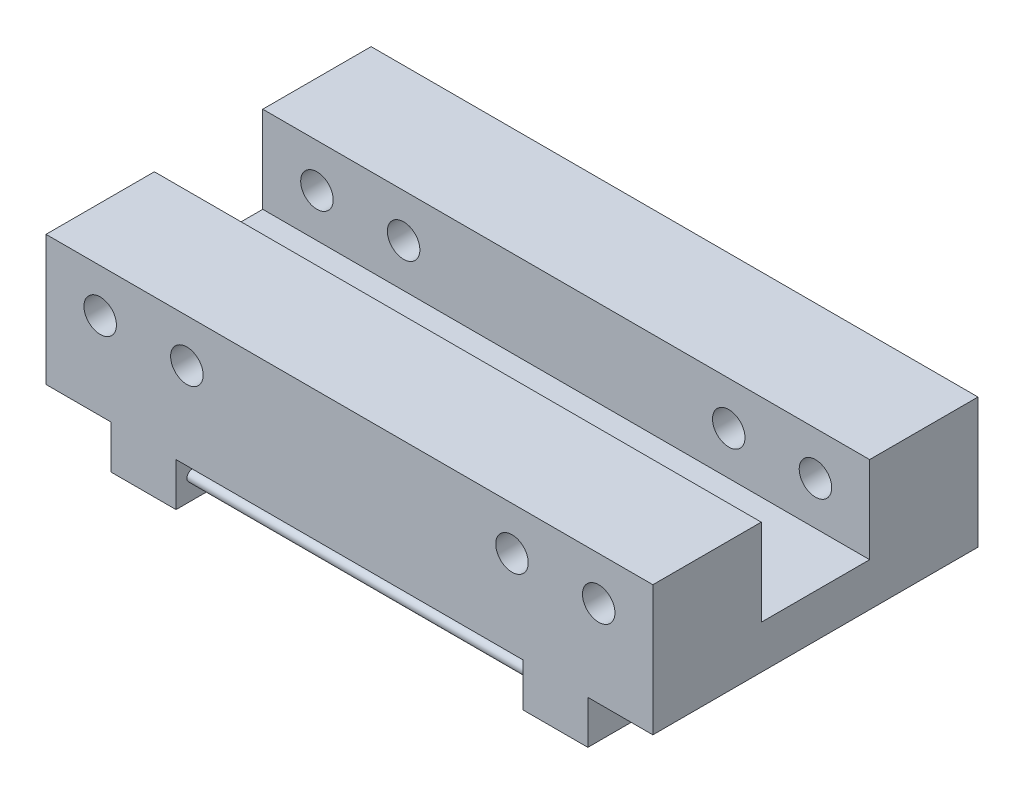
ISO-10303-21;
HEADER;
FILE_DESCRIPTION(('STEP AP214'),'2;1');
FILE_NAME('part.step','',(''),(''),'','','');
FILE_SCHEMA(('AUTOMOTIVE_DESIGN { 1 0 10303 214 1 1 1 1 }'));
ENDSEC;
DATA;
#1=APPLICATION_CONTEXT('core data for automotive mechanical design processes');
#2=APPLICATION_PROTOCOL_DEFINITION('international standard','automotive_design',2000,#1);
#3=PRODUCT_CONTEXT('',#1,'mechanical');
#4=PRODUCT('Part','Part','',(#3));
#5=PRODUCT_RELATED_PRODUCT_CATEGORY('part','',(#4));
#6=PRODUCT_DEFINITION_FORMATION('','',#4);
#7=PRODUCT_DEFINITION_CONTEXT('part definition',#1,'design');
#8=PRODUCT_DEFINITION('design','',#6,#7);
#9=PRODUCT_DEFINITION_SHAPE('','',#8);
#10=(LENGTH_UNIT() NAMED_UNIT(*) SI_UNIT(.MILLI.,.METRE.));
#11=(NAMED_UNIT(*) PLANE_ANGLE_UNIT() SI_UNIT($,.RADIAN.));
#12=(NAMED_UNIT(*) SI_UNIT($,.STERADIAN.) SOLID_ANGLE_UNIT());
#13=UNCERTAINTY_MEASURE_WITH_UNIT(LENGTH_MEASURE(1.E-05),#10,'distance_accuracy_value','');
#14=(GEOMETRIC_REPRESENTATION_CONTEXT(3) GLOBAL_UNCERTAINTY_ASSIGNED_CONTEXT((#13)) GLOBAL_UNIT_ASSIGNED_CONTEXT((#10,
#11,#12)) REPRESENTATION_CONTEXT('',''));
#15=CARTESIAN_POINT('',(0.,0.,0.));
#16=DIRECTION('',(0.,0.,1.));
#17=DIRECTION('',(1.,0.,0.));
#18=AXIS2_PLACEMENT_3D('',#15,#16,#17);
#19=CARTESIAN_POINT('',(0.,-20.,0.));
#20=DIRECTION('',(0.,1.,0.));
#21=DIRECTION('',(0.,0.,1.));
#22=AXIS2_PLACEMENT_3D('',#19,#20,#21);
#23=PLANE('',#22);
#24=DIRECTION('',(0.,0.,1.));
#25=VECTOR('',#24,1.);
#26=CARTESIAN_POINT('',(-30.0000000000001,-20.,-150.));
#27=LINE('',#26,#25);
#28=CARTESIAN_POINT('',(-30.0000000000001,-20.,-150.));
#29=VERTEX_POINT('',#28);
#30=CARTESIAN_POINT('',(-30.0000000000001,-20.,-120.));
#31=VERTEX_POINT('',#30);
#32=EDGE_CURVE('E300',#29,#31,#27,.T.);
#33=ORIENTED_EDGE('',*,*,#32,.F.);
#34=DIRECTION('',(-1.,0.,0.));
#35=VECTOR('',#34,1.);
#36=CARTESIAN_POINT('',(0.,-20.,-150.));
#37=LINE('',#36,#35);
#38=CARTESIAN_POINT('',(0.,-20.,-150.));
#39=VERTEX_POINT('',#38);
#40=EDGE_CURVE('E471',#39,#29,#37,.T.);
#41=ORIENTED_EDGE('',*,*,#40,.F.);
#42=DIRECTION('',(0.,0.,-1.));
#43=VECTOR('',#42,1.);
#44=CARTESIAN_POINT('',(0.,-20.,0.));
#45=LINE('',#44,#43);
#46=CARTESIAN_POINT('',(0.,-20.,0.));
#47=VERTEX_POINT('',#46);
#48=EDGE_CURVE('E465',#47,#39,#45,.T.);
#49=ORIENTED_EDGE('',*,*,#48,.F.);
#50=DIRECTION('',(1.,0.,0.));
#51=VECTOR('',#50,1.);
#52=CARTESIAN_POINT('',(0.,-20.,0.));
#53=LINE('',#52,#51);
#54=CARTESIAN_POINT('',(-30.,-20.,0.));
#55=VERTEX_POINT('',#54);
#56=EDGE_CURVE('E478',#55,#47,#53,.T.);
#57=ORIENTED_EDGE('',*,*,#56,.F.);
#58=DIRECTION('',(0.,0.,-1.));
#59=VECTOR('',#58,1.);
#60=CARTESIAN_POINT('',(-30.,-20.,0.));
#61=LINE('',#60,#59);
#62=CARTESIAN_POINT('',(-30.,-20.,-30.));
#63=VERTEX_POINT('',#62);
#64=EDGE_CURVE('E340',#55,#63,#61,.T.);
#65=ORIENTED_EDGE('',*,*,#64,.T.);
#66=DIRECTION('',(-1.,0.,0.));
#67=VECTOR('',#66,1.);
#68=CARTESIAN_POINT('',(-30.,-20.,-30.));
#69=LINE('',#68,#67);
#70=CARTESIAN_POINT('',(-60.,-20.,-30.));
#71=VERTEX_POINT('',#70);
#72=EDGE_CURVE('E346',#63,#71,#69,.T.);
#73=ORIENTED_EDGE('',*,*,#72,.T.);
#74=DIRECTION('',(0.,0.,1.));
#75=VECTOR('',#74,1.);
#76=CARTESIAN_POINT('',(-60.,-20.,0.));
#77=LINE('',#76,#75);
#78=CARTESIAN_POINT('',(-60.,-20.,0.));
#79=VERTEX_POINT('',#78);
#80=EDGE_CURVE('E362',#71,#79,#77,.T.);
#81=ORIENTED_EDGE('',*,*,#80,.T.);
#82=CARTESIAN_POINT('',(-220.,-20.,0.));
#83=VERTEX_POINT('',#82);
#84=EDGE_CURVE('E483',#83,#79,#53,.T.);
#85=ORIENTED_EDGE('',*,*,#84,.F.);
#86=DIRECTION('',(0.,0.,1.));
#87=VECTOR('',#86,1.);
#88=CARTESIAN_POINT('',(-220.,-20.,0.));
#89=LINE('',#88,#87);
#90=CARTESIAN_POINT('',(-220.,-20.,-30.));
#91=VERTEX_POINT('',#90);
#92=EDGE_CURVE('E429',#91,#83,#89,.T.);
#93=ORIENTED_EDGE('',*,*,#92,.F.);
#94=DIRECTION('',(1.,0.,0.));
#95=VECTOR('',#94,1.);
#96=CARTESIAN_POINT('',(-250.,-20.,-30.));
#97=LINE('',#96,#95);
#98=CARTESIAN_POINT('',(-250.,-20.,-30.));
#99=VERTEX_POINT('',#98);
#100=EDGE_CURVE('E442',#99,#91,#97,.T.);
#101=ORIENTED_EDGE('',*,*,#100,.F.);
#102=DIRECTION('',(0.,0.,-1.));
#103=VECTOR('',#102,1.);
#104=CARTESIAN_POINT('',(-250.,-20.,0.));
#105=LINE('',#104,#103);
#106=CARTESIAN_POINT('',(-250.,-20.,0.));
#107=VERTEX_POINT('',#106);
#108=EDGE_CURVE('E423',#107,#99,#105,.T.);
#109=ORIENTED_EDGE('',*,*,#108,.F.);
#110=CARTESIAN_POINT('',(-280.,-20.,0.));
#111=VERTEX_POINT('',#110);
#112=EDGE_CURVE('E479',#111,#107,#53,.T.);
#113=ORIENTED_EDGE('',*,*,#112,.F.);
#114=DIRECTION('',(0.,0.,1.));
#115=VECTOR('',#114,1.);
#116=CARTESIAN_POINT('',(-280.,-20.,0.));
#117=LINE('',#116,#115);
#118=CARTESIAN_POINT('',(-280.,-20.,-150.));
#119=VERTEX_POINT('',#118);
#120=EDGE_CURVE('E222',#119,#111,#117,.T.);
#121=ORIENTED_EDGE('',*,*,#120,.F.);
#122=CARTESIAN_POINT('',(-250.,-20.,-150.));
#123=VERTEX_POINT('',#122);
#124=EDGE_CURVE('E469',#123,#119,#37,.T.);
#125=ORIENTED_EDGE('',*,*,#124,.F.);
#126=DIRECTION('',(0.,0.,1.));
#127=VECTOR('',#126,1.);
#128=CARTESIAN_POINT('',(-250.,-20.,-150.));
#129=LINE('',#128,#127);
#130=CARTESIAN_POINT('',(-250.,-20.,-120.));
#131=VERTEX_POINT('',#130);
#132=EDGE_CURVE('E381',#123,#131,#129,.T.);
#133=ORIENTED_EDGE('',*,*,#132,.T.);
#134=DIRECTION('',(1.,0.,0.));
#135=VECTOR('',#134,1.);
#136=CARTESIAN_POINT('',(-250.,-20.,-120.));
#137=LINE('',#136,#135);
#138=CARTESIAN_POINT('',(-220.,-20.,-120.));
#139=VERTEX_POINT('',#138);
#140=EDGE_CURVE('E387',#131,#139,#137,.T.);
#141=ORIENTED_EDGE('',*,*,#140,.T.);
#142=DIRECTION('',(0.,0.,-1.));
#143=VECTOR('',#142,1.);
#144=CARTESIAN_POINT('',(-220.,-20.,-150.));
#145=LINE('',#144,#143);
#146=CARTESIAN_POINT('',(-220.,-20.,-150.));
#147=VERTEX_POINT('',#146);
#148=EDGE_CURVE('E403',#139,#147,#145,.T.);
#149=ORIENTED_EDGE('',*,*,#148,.T.);
#150=CARTESIAN_POINT('',(-60.0000000000001,-20.,-150.));
#151=VERTEX_POINT('',#150);
#152=EDGE_CURVE('E475',#151,#147,#37,.T.);
#153=ORIENTED_EDGE('',*,*,#152,.F.);
#154=DIRECTION('',(0.,0.,-1.));
#155=VECTOR('',#154,1.);
#156=CARTESIAN_POINT('',(-60.0000000000001,-20.,-150.));
#157=LINE('',#156,#155);
#158=CARTESIAN_POINT('',(-60.0000000000001,-20.,-120.));
#159=VERTEX_POINT('',#158);
#160=EDGE_CURVE('E309',#159,#151,#157,.T.);
#161=ORIENTED_EDGE('',*,*,#160,.F.);
#162=DIRECTION('',(-1.,0.,0.));
#163=VECTOR('',#162,1.);
#164=CARTESIAN_POINT('',(-30.0000000000001,-20.,-120.));
#165=LINE('',#164,#163);
#166=EDGE_CURVE('E322',#31,#159,#165,.T.);
#167=ORIENTED_EDGE('',*,*,#166,.F.);
#168=EDGE_LOOP('',(#33,#41,#49,#57,#65,#73,#81,#85,#93,#101,#109,#113,#121,#125,#133,#141,#149,
#153,#161,#167));
#169=FACE_BOUND('',#168,.T.);
#170=ADVANCED_FACE('F51',(#169),#23,.F.);
#171=CARTESIAN_POINT('',(0.,-20.,0.));
#172=DIRECTION('',(1.,0.,0.));
#173=DIRECTION('',(0.,0.,-1.));
#174=AXIS2_PLACEMENT_3D('',#171,#172,#173);
#175=PLANE('',#174);
#176=DIRECTION('',(0.,0.,-1.));
#177=VECTOR('',#176,1.);
#178=CARTESIAN_POINT('',(0.,0.,0.));
#179=LINE('',#178,#177);
#180=CARTESIAN_POINT('',(0.,0.,-50.));
#181=VERTEX_POINT('',#180);
#182=CARTESIAN_POINT('',(0.,0.,-99.9999999999999));
#183=VERTEX_POINT('',#182);
#184=EDGE_CURVE('E464',#181,#183,#179,.T.);
#185=ORIENTED_EDGE('',*,*,#184,.F.);
#186=DIRECTION('',(0.,-1.,0.));
#187=VECTOR('',#186,1.);
#188=CARTESIAN_POINT('',(0.,40.,-50.0000000000001));
#189=LINE('',#188,#187);
#190=CARTESIAN_POINT('',(0.,40.,-50.0000000000001));
#191=VERTEX_POINT('',#190);
#192=EDGE_CURVE('E258',#191,#181,#189,.T.);
#193=ORIENTED_EDGE('',*,*,#192,.F.);
#194=DIRECTION('',(0.,0.,1.));
#195=VECTOR('',#194,1.);
#196=CARTESIAN_POINT('',(0.,40.,0.));
#197=LINE('',#196,#195);
#198=CARTESIAN_POINT('',(0.,40.,0.));
#199=VERTEX_POINT('',#198);
#200=EDGE_CURVE('E244',#191,#199,#197,.T.);
#201=ORIENTED_EDGE('',*,*,#200,.T.);
#202=DIRECTION('',(0.,1.,0.));
#203=VECTOR('',#202,1.);
#204=CARTESIAN_POINT('',(0.,-20.,0.));
#205=LINE('',#204,#203);
#206=EDGE_CURVE('E228',#47,#199,#205,.T.);
#207=ORIENTED_EDGE('',*,*,#206,.F.);
#208=ORIENTED_EDGE('',*,*,#48,.T.);
#209=DIRECTION('',(0.,1.,0.));
#210=VECTOR('',#209,1.);
#211=CARTESIAN_POINT('',(0.,-20.,-150.));
#212=LINE('',#211,#210);
#213=CARTESIAN_POINT('',(0.,40.,-150.));
#214=VERTEX_POINT('',#213);
#215=EDGE_CURVE('E482',#39,#214,#212,.T.);
#216=ORIENTED_EDGE('',*,*,#215,.T.);
#217=DIRECTION('',(0.,0.,-1.));
#218=VECTOR('',#217,1.);
#219=CARTESIAN_POINT('',(0.,40.,-150.));
#220=LINE('',#219,#218);
#221=CARTESIAN_POINT('',(0.,40.,-99.9999999999999));
#222=VERTEX_POINT('',#221);
#223=EDGE_CURVE('E269',#222,#214,#220,.T.);
#224=ORIENTED_EDGE('',*,*,#223,.F.);
#225=DIRECTION('',(0.,-1.,0.));
#226=VECTOR('',#225,1.);
#227=CARTESIAN_POINT('',(0.,40.,-99.9999999999999));
#228=LINE('',#227,#226);
#229=EDGE_CURVE('E277',#222,#183,#228,.T.);
#230=ORIENTED_EDGE('',*,*,#229,.T.);
#231=EDGE_LOOP('',(#185,#193,#201,#207,#208,#216,#224,#230));
#232=FACE_BOUND('',#231,.T.);
#233=ADVANCED_FACE('F53',(#232),#175,.T.);
#234=CARTESIAN_POINT('',(0.,-20.,0.));
#235=DIRECTION('',(0.,0.,1.));
#236=DIRECTION('',(1.,0.,0.));
#237=AXIS2_PLACEMENT_3D('',#234,#235,#236);
#238=PLANE('',#237);
#239=CARTESIAN_POINT('',(-25.,20.,0.));
#240=DIRECTION('',(0.,0.,-1.));
#241=DIRECTION('',(-1.,0.,0.));
#242=AXIS2_PLACEMENT_3D('',#239,#240,#241);
#243=CIRCLE('',#242,7.5);
#244=CARTESIAN_POINT('',(-32.5,20.,0.));
#245=VERTEX_POINT('',#244);
#246=EDGE_CURVE('E510',#245,#245,#243,.T.);
#247=ORIENTED_EDGE('',*,*,#246,.T.);
#248=EDGE_LOOP('',(#247));
#249=FACE_BOUND('',#248,.T.);
#250=CARTESIAN_POINT('',(-65.,20.,0.));
#251=DIRECTION('',(0.,0.,-1.));
#252=DIRECTION('',(-1.,0.,0.));
#253=AXIS2_PLACEMENT_3D('',#250,#251,#252);
#254=CIRCLE('',#253,7.50000000000001);
#255=CARTESIAN_POINT('',(-72.5,20.,0.));
#256=VERTEX_POINT('',#255);
#257=EDGE_CURVE('E649',#256,#256,#254,.T.);
#258=ORIENTED_EDGE('',*,*,#257,.T.);
#259=EDGE_LOOP('',(#258));
#260=FACE_BOUND('',#259,.T.);
#261=CARTESIAN_POINT('',(-215.,20.,1.11022302462516E-13));
#262=DIRECTION('',(0.,0.,-1.));
#263=DIRECTION('',(-1.,0.,0.));
#264=AXIS2_PLACEMENT_3D('',#261,#262,#263);
#265=CIRCLE('',#264,7.50000000000001);
#266=CARTESIAN_POINT('',(-222.5,20.,1.12509208299067E-13));
#267=VERTEX_POINT('',#266);
#268=EDGE_CURVE('E638',#267,#267,#265,.T.);
#269=ORIENTED_EDGE('',*,*,#268,.T.);
#270=EDGE_LOOP('',(#269));
#271=FACE_BOUND('',#270,.T.);
#272=CARTESIAN_POINT('',(-255.,20.,1.11022302462516E-13));
#273=DIRECTION('',(0.,0.,-1.));
#274=DIRECTION('',(-1.,0.,0.));
#275=AXIS2_PLACEMENT_3D('',#272,#273,#274);
#276=CIRCLE('',#275,7.50000000000001);
#277=CARTESIAN_POINT('',(-262.5,20.,1.12509208299067E-13));
#278=VERTEX_POINT('',#277);
#279=EDGE_CURVE('E639',#278,#278,#276,.T.);
#280=ORIENTED_EDGE('',*,*,#279,.T.);
#281=EDGE_LOOP('',(#280));
#282=FACE_BOUND('',#281,.T.);
#283=ORIENTED_EDGE('',*,*,#206,.T.);
#284=DIRECTION('',(-1.,0.,0.));
#285=VECTOR('',#284,1.);
#286=CARTESIAN_POINT('',(-280.,40.,0.));
#287=LINE('',#286,#285);
#288=CARTESIAN_POINT('',(-280.,40.,0.));
#289=VERTEX_POINT('',#288);
#290=EDGE_CURVE('E235',#199,#289,#287,.T.);
#291=ORIENTED_EDGE('',*,*,#290,.T.);
#292=DIRECTION('',(0.,1.,0.));
#293=VECTOR('',#292,1.);
#294=CARTESIAN_POINT('',(-280.,-20.,0.));
#295=LINE('',#294,#293);
#296=EDGE_CURVE('E214',#111,#289,#295,.T.);
#297=ORIENTED_EDGE('',*,*,#296,.F.);
#298=ORIENTED_EDGE('',*,*,#112,.T.);
#299=DIRECTION('',(0.,1.,0.));
#300=VECTOR('',#299,1.);
#301=CARTESIAN_POINT('',(-250.,-40.,0.));
#302=LINE('',#301,#300);
#303=CARTESIAN_POINT('',(-250.,-40.,0.));
#304=VERTEX_POINT('',#303);
#305=EDGE_CURVE('E438',#304,#107,#302,.T.);
#306=ORIENTED_EDGE('',*,*,#305,.F.);
#307=DIRECTION('',(-1.,0.,0.));
#308=VECTOR('',#307,1.);
#309=CARTESIAN_POINT('',(-250.,-40.,0.));
#310=LINE('',#309,#308);
#311=CARTESIAN_POINT('',(-220.,-40.,0.));
#312=VERTEX_POINT('',#311);
#313=EDGE_CURVE('E435',#312,#304,#310,.T.);
#314=ORIENTED_EDGE('',*,*,#313,.F.);
#315=DIRECTION('',(0.,1.,0.));
#316=VECTOR('',#315,1.);
#317=CARTESIAN_POINT('',(-220.,-40.,0.));
#318=LINE('',#317,#316);
#319=EDGE_CURVE('E452',#312,#83,#318,.T.);
#320=ORIENTED_EDGE('',*,*,#319,.T.);
#321=ORIENTED_EDGE('',*,*,#84,.T.);
#322=DIRECTION('',(0.,1.,0.));
#323=VECTOR('',#322,1.);
#324=CARTESIAN_POINT('',(-60.,-40.,0.));
#325=LINE('',#324,#323);
#326=CARTESIAN_POINT('',(-60.,-40.,0.));
#327=VERTEX_POINT('',#326);
#328=EDGE_CURVE('E374',#327,#79,#325,.T.);
#329=ORIENTED_EDGE('',*,*,#328,.F.);
#330=DIRECTION('',(1.,0.,0.));
#331=VECTOR('',#330,1.);
#332=CARTESIAN_POINT('',(-30.,-40.,0.));
#333=LINE('',#332,#331);
#334=CARTESIAN_POINT('',(-30.,-40.,0.));
#335=VERTEX_POINT('',#334);
#336=EDGE_CURVE('E345',#327,#335,#333,.T.);
#337=ORIENTED_EDGE('',*,*,#336,.T.);
#338=DIRECTION('',(0.,1.,0.));
#339=VECTOR('',#338,1.);
#340=CARTESIAN_POINT('',(-30.,-40.,0.));
#341=LINE('',#340,#339);
#342=EDGE_CURVE('E377',#335,#55,#341,.T.);
#343=ORIENTED_EDGE('',*,*,#342,.T.);
#344=ORIENTED_EDGE('',*,*,#56,.T.);
#345=EDGE_LOOP('',(#283,#291,#297,#298,#306,#314,#320,#321,#329,#337,#343,#344));
#346=FACE_BOUND('',#345,.T.);
#347=ADVANCED_FACE('F241',(#249,#260,#271,#282,#346),#238,.T.);
#348=CARTESIAN_POINT('',(-280.,-20.,0.));
#349=DIRECTION('',(-1.,0.,0.));
#350=DIRECTION('',(0.,0.,1.));
#351=AXIS2_PLACEMENT_3D('',#348,#349,#350);
#352=PLANE('',#351);
#353=DIRECTION('',(0.,0.,1.));
#354=VECTOR('',#353,1.);
#355=CARTESIAN_POINT('',(-280.,0.,0.));
#356=LINE('',#355,#354);
#357=CARTESIAN_POINT('',(-280.,0.,-99.9999999999999));
#358=VERTEX_POINT('',#357);
#359=CARTESIAN_POINT('',(-280.,0.,-50.));
#360=VERTEX_POINT('',#359);
#361=EDGE_CURVE('E470',#358,#360,#356,.T.);
#362=ORIENTED_EDGE('',*,*,#361,.F.);
#363=DIRECTION('',(0.,-1.,0.));
#364=VECTOR('',#363,1.);
#365=CARTESIAN_POINT('',(-280.,40.,-99.9999999999999));
#366=LINE('',#365,#364);
#367=CARTESIAN_POINT('',(-280.,40.,-99.9999999999999));
#368=VERTEX_POINT('',#367);
#369=EDGE_CURVE('E283',#368,#358,#366,.T.);
#370=ORIENTED_EDGE('',*,*,#369,.F.);
#371=DIRECTION('',(0.,0.,1.));
#372=VECTOR('',#371,1.);
#373=CARTESIAN_POINT('',(-280.,40.,-150.));
#374=LINE('',#373,#372);
#375=CARTESIAN_POINT('',(-280.,40.,-150.));
#376=VERTEX_POINT('',#375);
#377=EDGE_CURVE('E262',#376,#368,#374,.T.);
#378=ORIENTED_EDGE('',*,*,#377,.F.);
#379=DIRECTION('',(0.,1.,0.));
#380=VECTOR('',#379,1.);
#381=CARTESIAN_POINT('',(-280.,-20.,-150.));
#382=LINE('',#381,#380);
#383=EDGE_CURVE('E229',#119,#376,#382,.T.);
#384=ORIENTED_EDGE('',*,*,#383,.F.);
#385=ORIENTED_EDGE('',*,*,#120,.T.);
#386=ORIENTED_EDGE('',*,*,#296,.T.);
#387=DIRECTION('',(0.,0.,-1.));
#388=VECTOR('',#387,1.);
#389=CARTESIAN_POINT('',(-280.,40.,0.));
#390=LINE('',#389,#388);
#391=CARTESIAN_POINT('',(-280.,40.,-50.));
#392=VERTEX_POINT('',#391);
#393=EDGE_CURVE('E218',#289,#392,#390,.T.);
#394=ORIENTED_EDGE('',*,*,#393,.T.);
#395=DIRECTION('',(0.,-1.,0.));
#396=VECTOR('',#395,1.);
#397=CARTESIAN_POINT('',(-280.,40.,-50.));
#398=LINE('',#397,#396);
#399=EDGE_CURVE('E252',#392,#360,#398,.T.);
#400=ORIENTED_EDGE('',*,*,#399,.T.);
#401=EDGE_LOOP('',(#362,#370,#378,#384,#385,#386,#394,#400));
#402=FACE_BOUND('',#401,.T.);
#403=ADVANCED_FACE('F216',(#402),#352,.T.);
#404=CARTESIAN_POINT('',(0.,-20.,-150.));
#405=DIRECTION('',(0.,0.,-1.));
#406=DIRECTION('',(-1.,0.,0.));
#407=AXIS2_PLACEMENT_3D('',#404,#405,#406);
#408=PLANE('',#407);
#409=CARTESIAN_POINT('',(-25.,20.,-150.));
#410=DIRECTION('',(0.,0.,-1.));
#411=DIRECTION('',(-1.,0.,0.));
#412=AXIS2_PLACEMENT_3D('',#409,#410,#411);
#413=CIRCLE('',#412,7.5);
#414=CARTESIAN_POINT('',(-32.5,20.,-150.));
#415=VERTEX_POINT('',#414);
#416=EDGE_CURVE('E624',#415,#415,#413,.T.);
#417=ORIENTED_EDGE('',*,*,#416,.F.);
#418=EDGE_LOOP('',(#417));
#419=FACE_BOUND('',#418,.T.);
#420=CARTESIAN_POINT('',(-65.,20.,-150.));
#421=DIRECTION('',(0.,0.,-1.));
#422=DIRECTION('',(-1.,0.,0.));
#423=AXIS2_PLACEMENT_3D('',#420,#421,#422);
#424=CIRCLE('',#423,7.50000000000001);
#425=CARTESIAN_POINT('',(-72.5,20.,-150.));
#426=VERTEX_POINT('',#425);
#427=EDGE_CURVE('E628',#426,#426,#424,.T.);
#428=ORIENTED_EDGE('',*,*,#427,.F.);
#429=EDGE_LOOP('',(#428));
#430=FACE_BOUND('',#429,.T.);
#431=CARTESIAN_POINT('',(-215.,20.,-150.));
#432=DIRECTION('',(0.,0.,-1.));
#433=DIRECTION('',(-1.,0.,0.));
#434=AXIS2_PLACEMENT_3D('',#431,#432,#433);
#435=CIRCLE('',#434,7.50000000000001);
#436=CARTESIAN_POINT('',(-222.5,20.,-150.));
#437=VERTEX_POINT('',#436);
#438=EDGE_CURVE('E632',#437,#437,#435,.T.);
#439=ORIENTED_EDGE('',*,*,#438,.F.);
#440=EDGE_LOOP('',(#439));
#441=FACE_BOUND('',#440,.T.);
#442=CARTESIAN_POINT('',(-255.,20.,-150.));
#443=DIRECTION('',(0.,0.,-1.));
#444=DIRECTION('',(-1.,0.,0.));
#445=AXIS2_PLACEMENT_3D('',#442,#443,#444);
#446=CIRCLE('',#445,7.50000000000001);
#447=CARTESIAN_POINT('',(-262.5,20.,-150.));
#448=VERTEX_POINT('',#447);
#449=EDGE_CURVE('E635',#448,#448,#446,.T.);
#450=ORIENTED_EDGE('',*,*,#449,.F.);
#451=EDGE_LOOP('',(#450));
#452=FACE_BOUND('',#451,.T.);
#453=ORIENTED_EDGE('',*,*,#383,.T.);
#454=DIRECTION('',(-1.,0.,0.));
#455=VECTOR('',#454,1.);
#456=CARTESIAN_POINT('',(-280.,40.,-150.));
#457=LINE('',#456,#455);
#458=EDGE_CURVE('E273',#214,#376,#457,.T.);
#459=ORIENTED_EDGE('',*,*,#458,.F.);
#460=ORIENTED_EDGE('',*,*,#215,.F.);
#461=ORIENTED_EDGE('',*,*,#40,.T.);
#462=DIRECTION('',(0.,1.,0.));
#463=VECTOR('',#462,1.);
#464=CARTESIAN_POINT('',(-30.0000000000001,-40.,-150.));
#465=LINE('',#464,#463);
#466=CARTESIAN_POINT('',(-30.0000000000001,-40.,-150.));
#467=VERTEX_POINT('',#466);
#468=EDGE_CURVE('E318',#467,#29,#465,.T.);
#469=ORIENTED_EDGE('',*,*,#468,.F.);
#470=DIRECTION('',(1.,0.,0.));
#471=VECTOR('',#470,1.);
#472=CARTESIAN_POINT('',(-30.0000000000001,-40.,-150.));
#473=LINE('',#472,#471);
#474=CARTESIAN_POINT('',(-60.0000000000001,-40.,-150.));
#475=VERTEX_POINT('',#474);
#476=EDGE_CURVE('E315',#475,#467,#473,.T.);
#477=ORIENTED_EDGE('',*,*,#476,.F.);
#478=DIRECTION('',(0.,1.,0.));
#479=VECTOR('',#478,1.);
#480=CARTESIAN_POINT('',(-60.0000000000001,-40.,-150.));
#481=LINE('',#480,#479);
#482=EDGE_CURVE('E330',#475,#151,#481,.T.);
#483=ORIENTED_EDGE('',*,*,#482,.T.);
#484=ORIENTED_EDGE('',*,*,#152,.T.);
#485=DIRECTION('',(0.,1.,0.));
#486=VECTOR('',#485,1.);
#487=CARTESIAN_POINT('',(-220.,-40.,-150.));
#488=LINE('',#487,#486);
#489=CARTESIAN_POINT('',(-220.,-40.,-150.));
#490=VERTEX_POINT('',#489);
#491=EDGE_CURVE('E415',#490,#147,#488,.T.);
#492=ORIENTED_EDGE('',*,*,#491,.F.);
#493=DIRECTION('',(-1.,0.,0.));
#494=VECTOR('',#493,1.);
#495=CARTESIAN_POINT('',(-250.,-40.,-150.));
#496=LINE('',#495,#494);
#497=CARTESIAN_POINT('',(-250.,-40.,-150.));
#498=VERTEX_POINT('',#497);
#499=EDGE_CURVE('E386',#490,#498,#496,.T.);
#500=ORIENTED_EDGE('',*,*,#499,.T.);
#501=DIRECTION('',(0.,1.,0.));
#502=VECTOR('',#501,1.);
#503=CARTESIAN_POINT('',(-250.,-40.,-150.));
#504=LINE('',#503,#502);
#505=EDGE_CURVE('E419',#498,#123,#504,.T.);
#506=ORIENTED_EDGE('',*,*,#505,.T.);
#507=ORIENTED_EDGE('',*,*,#124,.T.);
#508=EDGE_LOOP('',(#453,#459,#460,#461,#469,#477,#483,#484,#492,#500,#506,#507));
#509=FACE_BOUND('',#508,.T.);
#510=ADVANCED_FACE('F563',(#419,#430,#441,#452,#509),#408,.T.);
#511=CARTESIAN_POINT('',(0.,0.,0.));
#512=DIRECTION('',(0.,1.,0.));
#513=DIRECTION('',(0.,0.,1.));
#514=AXIS2_PLACEMENT_3D('',#511,#512,#513);
#515=PLANE('',#514);
#516=DIRECTION('',(1.,0.,0.));
#517=VECTOR('',#516,1.);
#518=CARTESIAN_POINT('',(-280.,0.,-50.));
#519=LINE('',#518,#517);
#520=EDGE_CURVE('E69',#360,#181,#519,.T.);
#521=ORIENTED_EDGE('',*,*,#520,.T.);
#522=ORIENTED_EDGE('',*,*,#184,.T.);
#523=DIRECTION('',(1.,0.,0.));
#524=VECTOR('',#523,1.);
#525=CARTESIAN_POINT('',(-280.,0.,-99.9999999999999));
#526=LINE('',#525,#524);
#527=EDGE_CURVE('E74',#358,#183,#526,.T.);
#528=ORIENTED_EDGE('',*,*,#527,.F.);
#529=ORIENTED_EDGE('',*,*,#361,.T.);
#530=EDGE_LOOP('',(#521,#522,#528,#529));
#531=FACE_BOUND('',#530,.T.);
#532=ADVANCED_FACE('F555',(#531),#515,.T.);
#533=CARTESIAN_POINT('',(-250.,-40.,0.));
#534=DIRECTION('',(1.,0.,0.));
#535=DIRECTION('',(0.,0.,-1.));
#536=AXIS2_PLACEMENT_3D('',#533,#534,#535);
#537=PLANE('',#536);
#538=ORIENTED_EDGE('',*,*,#108,.T.);
#539=DIRECTION('',(0.,1.,0.));
#540=VECTOR('',#539,1.);
#541=CARTESIAN_POINT('',(-250.,-40.,-30.));
#542=LINE('',#541,#540);
#543=CARTESIAN_POINT('',(-250.,-40.,-30.));
#544=VERTEX_POINT('',#543);
#545=EDGE_CURVE('E460',#544,#99,#542,.T.);
#546=ORIENTED_EDGE('',*,*,#545,.F.);
#547=DIRECTION('',(0.,0.,-1.));
#548=VECTOR('',#547,1.);
#549=CARTESIAN_POINT('',(-250.,-40.,0.));
#550=LINE('',#549,#548);
#551=EDGE_CURVE('E424',#304,#544,#550,.T.);
#552=ORIENTED_EDGE('',*,*,#551,.F.);
#553=ORIENTED_EDGE('',*,*,#305,.T.);
#554=EDGE_LOOP('',(#538,#546,#552,#553));
#555=FACE_BOUND('',#554,.T.);
#556=ADVANCED_FACE('F608',(#555),#537,.F.);
#557=CARTESIAN_POINT('',(-250.,-40.,-30.));
#558=DIRECTION('',(0.,0.,1.));
#559=DIRECTION('',(1.,0.,0.));
#560=AXIS2_PLACEMENT_3D('',#557,#558,#559);
#561=PLANE('',#560);
#562=ORIENTED_EDGE('',*,*,#100,.T.);
#563=DIRECTION('',(0.,1.,0.));
#564=VECTOR('',#563,1.);
#565=CARTESIAN_POINT('',(-220.,-40.,-30.));
#566=LINE('',#565,#564);
#567=CARTESIAN_POINT('',(-220.,-40.,-30.));
#568=VERTEX_POINT('',#567);
#569=EDGE_CURVE('E456',#568,#91,#566,.T.);
#570=ORIENTED_EDGE('',*,*,#569,.F.);
#571=DIRECTION('',(1.,0.,0.));
#572=VECTOR('',#571,1.);
#573=CARTESIAN_POINT('',(-250.,-40.,-30.));
#574=LINE('',#573,#572);
#575=EDGE_CURVE('E428',#544,#568,#574,.T.);
#576=ORIENTED_EDGE('',*,*,#575,.F.);
#577=ORIENTED_EDGE('',*,*,#545,.T.);
#578=EDGE_LOOP('',(#562,#570,#576,#577));
#579=FACE_BOUND('',#578,.T.);
#580=ADVANCED_FACE('F796',(#579),#561,.F.);
#581=CARTESIAN_POINT('',(-220.,-40.,0.));
#582=DIRECTION('',(-1.,0.,0.));
#583=DIRECTION('',(0.,0.,1.));
#584=AXIS2_PLACEMENT_3D('',#581,#582,#583);
#585=PLANE('',#584);
#586=CARTESIAN_POINT('',(-220.,-30.,-7.50000000000018));
#587=DIRECTION('',(-1.,0.,0.));
#588=DIRECTION('',(0.,0.,1.));
#589=AXIS2_PLACEMENT_3D('',#586,#587,#588);
#590=CIRCLE('',#589,2.5);
#591=CARTESIAN_POINT('',(-220.,-30.,-5.00000000000018));
#592=VERTEX_POINT('',#591);
#593=EDGE_CURVE('E498',#592,#592,#590,.F.);
#594=ORIENTED_EDGE('',*,*,#593,.F.);
#595=EDGE_LOOP('',(#594));
#596=FACE_BOUND('',#595,.T.);
#597=CARTESIAN_POINT('',(-220.,-30.,-22.5000000000002));
#598=DIRECTION('',(-1.,0.,0.));
#599=DIRECTION('',(0.,0.,1.));
#600=AXIS2_PLACEMENT_3D('',#597,#598,#599);
#601=CIRCLE('',#600,2.5);
#602=CARTESIAN_POINT('',(-220.,-30.,-20.0000000000002));
#603=VERTEX_POINT('',#602);
#604=EDGE_CURVE('E489',#603,#603,#601,.F.);
#605=ORIENTED_EDGE('',*,*,#604,.F.);
#606=EDGE_LOOP('',(#605));
#607=FACE_BOUND('',#606,.T.);
#608=ORIENTED_EDGE('',*,*,#92,.T.);
#609=ORIENTED_EDGE('',*,*,#319,.F.);
#610=DIRECTION('',(0.,0.,1.));
#611=VECTOR('',#610,1.);
#612=CARTESIAN_POINT('',(-220.,-40.,0.));
#613=LINE('',#612,#611);
#614=EDGE_CURVE('E432',#568,#312,#613,.T.);
#615=ORIENTED_EDGE('',*,*,#614,.F.);
#616=ORIENTED_EDGE('',*,*,#569,.T.);
#617=EDGE_LOOP('',(#608,#609,#615,#616));
#618=FACE_BOUND('',#617,.T.);
#619=ADVANCED_FACE('F599',(#596,#607,#618),#585,.F.);
#620=CARTESIAN_POINT('',(0.,-40.,0.));
#621=DIRECTION('',(0.,-1.,0.));
#622=DIRECTION('',(0.,0.,-1.));
#623=AXIS2_PLACEMENT_3D('',#620,#621,#622);
#624=PLANE('',#623);
#625=ORIENTED_EDGE('',*,*,#551,.T.);
#626=ORIENTED_EDGE('',*,*,#575,.T.);
#627=ORIENTED_EDGE('',*,*,#614,.T.);
#628=ORIENTED_EDGE('',*,*,#313,.T.);
#629=EDGE_LOOP('',(#625,#626,#627,#628));
#630=FACE_BOUND('',#629,.T.);
#631=ADVANCED_FACE('F589',(#630),#624,.T.);
#632=CARTESIAN_POINT('',(-250.,-40.,-150.));
#633=DIRECTION('',(-1.,0.,0.));
#634=DIRECTION('',(0.,0.,1.));
#635=AXIS2_PLACEMENT_3D('',#632,#633,#634);
#636=PLANE('',#635);
#637=ORIENTED_EDGE('',*,*,#132,.F.);
#638=ORIENTED_EDGE('',*,*,#505,.F.);
#639=DIRECTION('',(0.,0.,1.));
#640=VECTOR('',#639,1.);
#641=CARTESIAN_POINT('',(-250.,-40.,-150.));
#642=LINE('',#641,#640);
#643=CARTESIAN_POINT('',(-250.,-40.,-120.));
#644=VERTEX_POINT('',#643);
#645=EDGE_CURVE('E382',#498,#644,#642,.T.);
#646=ORIENTED_EDGE('',*,*,#645,.T.);
#647=DIRECTION('',(0.,1.,0.));
#648=VECTOR('',#647,1.);
#649=CARTESIAN_POINT('',(-250.,-40.,-120.));
#650=LINE('',#649,#648);
#651=EDGE_CURVE('E399',#644,#131,#650,.T.);
#652=ORIENTED_EDGE('',*,*,#651,.T.);
#653=EDGE_LOOP('',(#637,#638,#646,#652));
#654=FACE_BOUND('',#653,.T.);
#655=ADVANCED_FACE('F587',(#654),#636,.T.);
#656=CARTESIAN_POINT('',(-220.,-40.,-150.));
#657=DIRECTION('',(1.,0.,0.));
#658=DIRECTION('',(0.,0.,-1.));
#659=AXIS2_PLACEMENT_3D('',#656,#657,#658);
#660=PLANE('',#659);
#661=CARTESIAN_POINT('',(-220.,-30.,-142.5));
#662=DIRECTION('',(1.,0.,0.));
#663=DIRECTION('',(0.,0.,-1.));
#664=AXIS2_PLACEMENT_3D('',#661,#662,#663);
#665=CIRCLE('',#664,2.5);
#666=CARTESIAN_POINT('',(-220.,-30.,-145.));
#667=VERTEX_POINT('',#666);
#668=EDGE_CURVE('E11',#667,#667,#665,.T.);
#669=ORIENTED_EDGE('',*,*,#668,.F.);
#670=EDGE_LOOP('',(#669));
#671=FACE_BOUND('',#670,.T.);
#672=CARTESIAN_POINT('',(-220.,-30.,-127.5));
#673=DIRECTION('',(1.,0.,0.));
#674=DIRECTION('',(0.,0.,-1.));
#675=AXIS2_PLACEMENT_3D('',#672,#673,#674);
#676=CIRCLE('',#675,2.5);
#677=CARTESIAN_POINT('',(-220.,-30.,-130.));
#678=VERTEX_POINT('',#677);
#679=EDGE_CURVE('E61',#678,#678,#676,.T.);
#680=ORIENTED_EDGE('',*,*,#679,.F.);
#681=EDGE_LOOP('',(#680));
#682=FACE_BOUND('',#681,.T.);
#683=ORIENTED_EDGE('',*,*,#148,.F.);
#684=DIRECTION('',(0.,1.,0.));
#685=VECTOR('',#684,1.);
#686=CARTESIAN_POINT('',(-220.,-40.,-120.));
#687=LINE('',#686,#685);
#688=CARTESIAN_POINT('',(-220.,-40.,-120.));
#689=VERTEX_POINT('',#688);
#690=EDGE_CURVE('E412',#689,#139,#687,.T.);
#691=ORIENTED_EDGE('',*,*,#690,.F.);
#692=DIRECTION('',(0.,0.,-1.));
#693=VECTOR('',#692,1.);
#694=CARTESIAN_POINT('',(-220.,-40.,-150.));
#695=LINE('',#694,#693);
#696=EDGE_CURVE('E391',#689,#490,#695,.T.);
#697=ORIENTED_EDGE('',*,*,#696,.T.);
#698=ORIENTED_EDGE('',*,*,#491,.T.);
#699=EDGE_LOOP('',(#683,#691,#697,#698));
#700=FACE_BOUND('',#699,.T.);
#701=ADVANCED_FACE('F576',(#671,#682,#700),#660,.T.);
#702=CARTESIAN_POINT('',(-250.,-40.,-120.));
#703=DIRECTION('',(0.,0.,1.));
#704=DIRECTION('',(1.,0.,0.));
#705=AXIS2_PLACEMENT_3D('',#702,#703,#704);
#706=PLANE('',#705);
#707=ORIENTED_EDGE('',*,*,#140,.F.);
#708=ORIENTED_EDGE('',*,*,#651,.F.);
#709=DIRECTION('',(1.,0.,0.));
#710=VECTOR('',#709,1.);
#711=CARTESIAN_POINT('',(-250.,-40.,-120.));
#712=LINE('',#711,#710);
#713=EDGE_CURVE('E395',#644,#689,#712,.T.);
#714=ORIENTED_EDGE('',*,*,#713,.T.);
#715=ORIENTED_EDGE('',*,*,#690,.T.);
#716=EDGE_LOOP('',(#707,#708,#714,#715));
#717=FACE_BOUND('',#716,.T.);
#718=ADVANCED_FACE('F581',(#717),#706,.T.);
#719=CARTESIAN_POINT('',(0.,-40.,-150.));
#720=DIRECTION('',(0.,-1.,0.));
#721=DIRECTION('',(0.,0.,1.));
#722=AXIS2_PLACEMENT_3D('',#719,#720,#721);
#723=PLANE('',#722);
#724=ORIENTED_EDGE('',*,*,#645,.F.);
#725=ORIENTED_EDGE('',*,*,#499,.F.);
#726=ORIENTED_EDGE('',*,*,#696,.F.);
#727=ORIENTED_EDGE('',*,*,#713,.F.);
#728=EDGE_LOOP('',(#724,#725,#726,#727));
#729=FACE_BOUND('',#728,.T.);
#730=ADVANCED_FACE('F585',(#729),#723,.T.);
#731=CARTESIAN_POINT('',(-30.,-40.,0.));
#732=DIRECTION('',(1.,0.,0.));
#733=DIRECTION('',(0.,0.,-1.));
#734=AXIS2_PLACEMENT_3D('',#731,#732,#733);
#735=PLANE('',#734);
#736=ORIENTED_EDGE('',*,*,#64,.F.);
#737=ORIENTED_EDGE('',*,*,#342,.F.);
#738=DIRECTION('',(0.,0.,-1.));
#739=VECTOR('',#738,1.);
#740=CARTESIAN_POINT('',(-30.,-40.,0.));
#741=LINE('',#740,#739);
#742=CARTESIAN_POINT('',(-30.,-40.,-30.));
#743=VERTEX_POINT('',#742);
#744=EDGE_CURVE('E341',#335,#743,#741,.T.);
#745=ORIENTED_EDGE('',*,*,#744,.T.);
#746=DIRECTION('',(0.,1.,0.));
#747=VECTOR('',#746,1.);
#748=CARTESIAN_POINT('',(-30.,-40.,-30.));
#749=LINE('',#748,#747);
#750=EDGE_CURVE('E358',#743,#63,#749,.T.);
#751=ORIENTED_EDGE('',*,*,#750,.T.);
#752=EDGE_LOOP('',(#736,#737,#745,#751));
#753=FACE_BOUND('',#752,.T.);
#754=ADVANCED_FACE('F742',(#753),#735,.T.);
#755=CARTESIAN_POINT('',(-60.,-40.,0.));
#756=DIRECTION('',(-1.,0.,0.));
#757=DIRECTION('',(0.,0.,1.));
#758=AXIS2_PLACEMENT_3D('',#755,#756,#757);
#759=PLANE('',#758);
#760=CARTESIAN_POINT('',(-60.,-30.,-7.50000000000003));
#761=DIRECTION('',(1.,0.,0.));
#762=DIRECTION('',(0.,0.,-1.));
#763=AXIS2_PLACEMENT_3D('',#760,#761,#762);
#764=CIRCLE('',#763,2.5);
#765=CARTESIAN_POINT('',(-60.,-30.,-10.));
#766=VERTEX_POINT('',#765);
#767=EDGE_CURVE('E296',#766,#766,#764,.T.);
#768=ORIENTED_EDGE('',*,*,#767,.T.);
#769=EDGE_LOOP('',(#768));
#770=FACE_BOUND('',#769,.T.);
#771=CARTESIAN_POINT('',(-60.,-30.,-22.5));
#772=DIRECTION('',(1.,0.,0.));
#773=DIRECTION('',(0.,0.,-1.));
#774=AXIS2_PLACEMENT_3D('',#771,#772,#773);
#775=CIRCLE('',#774,2.5);
#776=CARTESIAN_POINT('',(-60.,-30.,-25.));
#777=VERTEX_POINT('',#776);
#778=EDGE_CURVE('E292',#777,#777,#775,.T.);
#779=ORIENTED_EDGE('',*,*,#778,.T.);
#780=EDGE_LOOP('',(#779));
#781=FACE_BOUND('',#780,.T.);
#782=ORIENTED_EDGE('',*,*,#80,.F.);
#783=DIRECTION('',(0.,1.,0.));
#784=VECTOR('',#783,1.);
#785=CARTESIAN_POINT('',(-60.,-40.,-30.));
#786=LINE('',#785,#784);
#787=CARTESIAN_POINT('',(-60.,-40.,-30.));
#788=VERTEX_POINT('',#787);
#789=EDGE_CURVE('E371',#788,#71,#786,.T.);
#790=ORIENTED_EDGE('',*,*,#789,.F.);
#791=DIRECTION('',(0.,0.,1.));
#792=VECTOR('',#791,1.);
#793=CARTESIAN_POINT('',(-60.,-40.,0.));
#794=LINE('',#793,#792);
#795=EDGE_CURVE('E350',#788,#327,#794,.T.);
#796=ORIENTED_EDGE('',*,*,#795,.T.);
#797=ORIENTED_EDGE('',*,*,#328,.T.);
#798=EDGE_LOOP('',(#782,#790,#796,#797));
#799=FACE_BOUND('',#798,.T.);
#800=ADVANCED_FACE('F738',(#770,#781,#799),#759,.T.);
#801=CARTESIAN_POINT('',(-30.,-40.,-30.));
#802=DIRECTION('',(0.,0.,-1.));
#803=DIRECTION('',(-1.,0.,0.));
#804=AXIS2_PLACEMENT_3D('',#801,#802,#803);
#805=PLANE('',#804);
#806=ORIENTED_EDGE('',*,*,#72,.F.);
#807=ORIENTED_EDGE('',*,*,#750,.F.);
#808=DIRECTION('',(-1.,0.,0.));
#809=VECTOR('',#808,1.);
#810=CARTESIAN_POINT('',(-30.,-40.,-30.));
#811=LINE('',#810,#809);
#812=EDGE_CURVE('E354',#743,#788,#811,.T.);
#813=ORIENTED_EDGE('',*,*,#812,.T.);
#814=ORIENTED_EDGE('',*,*,#789,.T.);
#815=EDGE_LOOP('',(#806,#807,#813,#814));
#816=FACE_BOUND('',#815,.T.);
#817=ADVANCED_FACE('F734',(#816),#805,.T.);
#818=CARTESIAN_POINT('',(-280.,-40.,0.));
#819=DIRECTION('',(0.,-1.,0.));
#820=DIRECTION('',(0.,0.,-1.));
#821=AXIS2_PLACEMENT_3D('',#818,#819,#820);
#822=PLANE('',#821);
#823=ORIENTED_EDGE('',*,*,#744,.F.);
#824=ORIENTED_EDGE('',*,*,#336,.F.);
#825=ORIENTED_EDGE('',*,*,#795,.F.);
#826=ORIENTED_EDGE('',*,*,#812,.F.);
#827=EDGE_LOOP('',(#823,#824,#825,#826));
#828=FACE_BOUND('',#827,.T.);
#829=ADVANCED_FACE('F730',(#828),#822,.T.);
#830=CARTESIAN_POINT('',(-30.0000000000001,-40.,-150.));
#831=DIRECTION('',(-1.,0.,0.));
#832=DIRECTION('',(0.,0.,1.));
#833=AXIS2_PLACEMENT_3D('',#830,#831,#832);
#834=PLANE('',#833);
#835=ORIENTED_EDGE('',*,*,#32,.T.);
#836=DIRECTION('',(0.,1.,0.));
#837=VECTOR('',#836,1.);
#838=CARTESIAN_POINT('',(-30.0000000000001,-40.,-120.));
#839=LINE('',#838,#837);
#840=CARTESIAN_POINT('',(-30.0000000000001,-40.,-120.));
#841=VERTEX_POINT('',#840);
#842=EDGE_CURVE('E337',#841,#31,#839,.T.);
#843=ORIENTED_EDGE('',*,*,#842,.F.);
#844=DIRECTION('',(0.,0.,1.));
#845=VECTOR('',#844,1.);
#846=CARTESIAN_POINT('',(-30.0000000000001,-40.,-150.));
#847=LINE('',#846,#845);
#848=EDGE_CURVE('E304',#467,#841,#847,.T.);
#849=ORIENTED_EDGE('',*,*,#848,.F.);
#850=ORIENTED_EDGE('',*,*,#468,.T.);
#851=EDGE_LOOP('',(#835,#843,#849,#850));
#852=FACE_BOUND('',#851,.T.);
#853=ADVANCED_FACE('F726',(#852),#834,.F.);
#854=CARTESIAN_POINT('',(-30.0000000000001,-40.,-120.));
#855=DIRECTION('',(0.,0.,-1.));
#856=DIRECTION('',(-1.,0.,0.));
#857=AXIS2_PLACEMENT_3D('',#854,#855,#856);
#858=PLANE('',#857);
#859=ORIENTED_EDGE('',*,*,#166,.T.);
#860=DIRECTION('',(0.,1.,0.));
#861=VECTOR('',#860,1.);
#862=CARTESIAN_POINT('',(-60.0000000000001,-40.,-120.));
#863=LINE('',#862,#861);
#864=CARTESIAN_POINT('',(-60.0000000000001,-40.,-120.));
#865=VERTEX_POINT('',#864);
#866=EDGE_CURVE('E333',#865,#159,#863,.T.);
#867=ORIENTED_EDGE('',*,*,#866,.F.);
#868=DIRECTION('',(-1.,0.,0.));
#869=VECTOR('',#868,1.);
#870=CARTESIAN_POINT('',(-30.0000000000001,-40.,-120.));
#871=LINE('',#870,#869);
#872=EDGE_CURVE('E308',#841,#865,#871,.T.);
#873=ORIENTED_EDGE('',*,*,#872,.F.);
#874=ORIENTED_EDGE('',*,*,#842,.T.);
#875=EDGE_LOOP('',(#859,#867,#873,#874));
#876=FACE_BOUND('',#875,.T.);
#877=ADVANCED_FACE('F722',(#876),#858,.F.);
#878=CARTESIAN_POINT('',(-60.0000000000001,-40.,-150.));
#879=DIRECTION('',(1.,0.,0.));
#880=DIRECTION('',(0.,0.,-1.));
#881=AXIS2_PLACEMENT_3D('',#878,#879,#880);
#882=PLANE('',#881);
#883=CARTESIAN_POINT('',(-60.0000000000001,-30.,-142.5));
#884=DIRECTION('',(-1.,0.,0.));
#885=DIRECTION('',(0.,0.,1.));
#886=AXIS2_PLACEMENT_3D('',#883,#884,#885);
#887=CIRCLE('',#886,2.5);
#888=CARTESIAN_POINT('',(-60.0000000000001,-30.,-140.));
#889=VERTEX_POINT('',#888);
#890=EDGE_CURVE('E288',#889,#889,#887,.T.);
#891=ORIENTED_EDGE('',*,*,#890,.F.);
#892=EDGE_LOOP('',(#891));
#893=FACE_BOUND('',#892,.T.);
#894=CARTESIAN_POINT('',(-60.,-30.,-127.5));
#895=DIRECTION('',(-1.,0.,0.));
#896=DIRECTION('',(0.,0.,1.));
#897=AXIS2_PLACEMENT_3D('',#894,#895,#896);
#898=CIRCLE('',#897,2.5);
#899=CARTESIAN_POINT('',(-60.,-30.,-125.));
#900=VERTEX_POINT('',#899);
#901=EDGE_CURVE('E287',#900,#900,#898,.T.);
#902=ORIENTED_EDGE('',*,*,#901,.F.);
#903=EDGE_LOOP('',(#902));
#904=FACE_BOUND('',#903,.T.);
#905=ORIENTED_EDGE('',*,*,#160,.T.);
#906=ORIENTED_EDGE('',*,*,#482,.F.);
#907=DIRECTION('',(0.,0.,-1.));
#908=VECTOR('',#907,1.);
#909=CARTESIAN_POINT('',(-60.0000000000001,-40.,-150.));
#910=LINE('',#909,#908);
#911=EDGE_CURVE('E312',#865,#475,#910,.T.);
#912=ORIENTED_EDGE('',*,*,#911,.F.);
#913=ORIENTED_EDGE('',*,*,#866,.T.);
#914=EDGE_LOOP('',(#905,#906,#912,#913));
#915=FACE_BOUND('',#914,.T.);
#916=ADVANCED_FACE('F718',(#893,#904,#915),#882,.F.);
#917=CARTESIAN_POINT('',(-280.,-40.,-150.));
#918=DIRECTION('',(0.,-1.,0.));
#919=DIRECTION('',(0.,0.,1.));
#920=AXIS2_PLACEMENT_3D('',#917,#918,#919);
#921=PLANE('',#920);
#922=ORIENTED_EDGE('',*,*,#848,.T.);
#923=ORIENTED_EDGE('',*,*,#872,.T.);
#924=ORIENTED_EDGE('',*,*,#911,.T.);
#925=ORIENTED_EDGE('',*,*,#476,.T.);
#926=EDGE_LOOP('',(#922,#923,#924,#925));
#927=FACE_BOUND('',#926,.T.);
#928=ADVANCED_FACE('F714',(#927),#921,.T.);
#929=CARTESIAN_POINT('',(-60.,-30.,-22.5));
#930=DIRECTION('',(-1.,0.,0.));
#931=DIRECTION('',(0.,0.,1.));
#932=AXIS2_PLACEMENT_3D('',#929,#930,#931);
#933=CYLINDRICAL_SURFACE('',#932,2.5);
#934=ORIENTED_EDGE('',*,*,#778,.F.);
#935=EDGE_LOOP('',(#934));
#936=FACE_BOUND('',#935,.T.);
#937=ORIENTED_EDGE('',*,*,#604,.T.);
#938=EDGE_LOOP('',(#937));
#939=FACE_BOUND('',#938,.T.);
#940=ADVANCED_FACE('F710',(#936,#939),#933,.T.);
#941=CARTESIAN_POINT('',(-60.,-30.,-7.50000000000003));
#942=DIRECTION('',(-1.,0.,0.));
#943=DIRECTION('',(0.,0.,1.));
#944=AXIS2_PLACEMENT_3D('',#941,#942,#943);
#945=CYLINDRICAL_SURFACE('',#944,2.5);
#946=ORIENTED_EDGE('',*,*,#767,.F.);
#947=EDGE_LOOP('',(#946));
#948=FACE_BOUND('',#947,.T.);
#949=ORIENTED_EDGE('',*,*,#593,.T.);
#950=EDGE_LOOP('',(#949));
#951=FACE_BOUND('',#950,.T.);
#952=ADVANCED_FACE('F706',(#948,#951),#945,.T.);
#953=CARTESIAN_POINT('',(-60.,-30.,-127.5));
#954=DIRECTION('',(-1.,0.,0.));
#955=DIRECTION('',(0.,0.,1.));
#956=AXIS2_PLACEMENT_3D('',#953,#954,#955);
#957=CYLINDRICAL_SURFACE('',#956,2.5);
#958=ORIENTED_EDGE('',*,*,#901,.T.);
#959=EDGE_LOOP('',(#958));
#960=FACE_BOUND('',#959,.T.);
#961=ORIENTED_EDGE('',*,*,#679,.T.);
#962=EDGE_LOOP('',(#961));
#963=FACE_BOUND('',#962,.T.);
#964=ADVANCED_FACE('F702',(#960,#963),#957,.T.);
#965=CARTESIAN_POINT('',(-60.0000000000001,-30.,-142.5));
#966=DIRECTION('',(-1.,0.,0.));
#967=DIRECTION('',(0.,0.,1.));
#968=AXIS2_PLACEMENT_3D('',#965,#966,#967);
#969=CYLINDRICAL_SURFACE('',#968,2.5);
#970=ORIENTED_EDGE('',*,*,#890,.T.);
#971=EDGE_LOOP('',(#970));
#972=FACE_BOUND('',#971,.T.);
#973=ORIENTED_EDGE('',*,*,#668,.T.);
#974=EDGE_LOOP('',(#973));
#975=FACE_BOUND('',#974,.T.);
#976=ADVANCED_FACE('F699',(#972,#975),#969,.T.);
#977=CARTESIAN_POINT('',(-280.,40.,-99.9999999999999));
#978=DIRECTION('',(0.,0.,-1.));
#979=DIRECTION('',(-1.,0.,0.));
#980=AXIS2_PLACEMENT_3D('',#977,#978,#979);
#981=PLANE('',#980);
#982=CARTESIAN_POINT('',(-25.,20.,-99.9999999999999));
#983=DIRECTION('',(0.,0.,-1.));
#984=DIRECTION('',(-1.,0.,0.));
#985=AXIS2_PLACEMENT_3D('',#982,#983,#984);
#986=CIRCLE('',#985,7.5);
#987=CARTESIAN_POINT('',(-32.5,20.,-99.9999999999999));
#988=VERTEX_POINT('',#987);
#989=EDGE_CURVE('E255',#988,#988,#986,.T.);
#990=ORIENTED_EDGE('',*,*,#989,.T.);
#991=EDGE_LOOP('',(#990));
#992=FACE_BOUND('',#991,.T.);
#993=CARTESIAN_POINT('',(-65.,20.,-99.9999999999999));
#994=DIRECTION('',(0.,0.,-1.));
#995=DIRECTION('',(-1.,0.,0.));
#996=AXIS2_PLACEMENT_3D('',#993,#994,#995);
#997=CIRCLE('',#996,7.50000000000001);
#998=CARTESIAN_POINT('',(-72.5,20.,-99.9999999999999));
#999=VERTEX_POINT('',#998);
#1000=EDGE_CURVE('E518',#999,#999,#997,.T.);
#1001=ORIENTED_EDGE('',*,*,#1000,.T.);
#1002=EDGE_LOOP('',(#1001));
#1003=FACE_BOUND('',#1002,.T.);
#1004=CARTESIAN_POINT('',(-215.,20.,-99.9999999999999));
#1005=DIRECTION('',(0.,0.,-1.));
#1006=DIRECTION('',(-1.,0.,0.));
#1007=AXIS2_PLACEMENT_3D('',#1004,#1005,#1006);
#1008=CIRCLE('',#1007,7.50000000000001);
#1009=CARTESIAN_POINT('',(-222.5,20.,-99.9999999999999));
#1010=VERTEX_POINT('',#1009);
#1011=EDGE_CURVE('E514',#1010,#1010,#1008,.T.);
#1012=ORIENTED_EDGE('',*,*,#1011,.T.);
#1013=EDGE_LOOP('',(#1012));
#1014=FACE_BOUND('',#1013,.T.);
#1015=CARTESIAN_POINT('',(-255.,20.,-99.9999999999999));
#1016=DIRECTION('',(0.,0.,-1.));
#1017=DIRECTION('',(-1.,0.,0.));
#1018=AXIS2_PLACEMENT_3D('',#1015,#1016,#1017);
#1019=CIRCLE('',#1018,7.50000000000001);
#1020=CARTESIAN_POINT('',(-262.5,20.,-99.9999999999999));
#1021=VERTEX_POINT('',#1020);
#1022=EDGE_CURVE('E509',#1021,#1021,#1019,.T.);
#1023=ORIENTED_EDGE('',*,*,#1022,.T.);
#1024=EDGE_LOOP('',(#1023));
#1025=FACE_BOUND('',#1024,.T.);
#1026=ORIENTED_EDGE('',*,*,#527,.T.);
#1027=ORIENTED_EDGE('',*,*,#229,.F.);
#1028=DIRECTION('',(1.,0.,0.));
#1029=VECTOR('',#1028,1.);
#1030=CARTESIAN_POINT('',(-280.,40.,-99.9999999999999));
#1031=LINE('',#1030,#1029);
#1032=EDGE_CURVE('E266',#368,#222,#1031,.T.);
#1033=ORIENTED_EDGE('',*,*,#1032,.F.);
#1034=ORIENTED_EDGE('',*,*,#369,.T.);
#1035=EDGE_LOOP('',(#1026,#1027,#1033,#1034));
#1036=FACE_BOUND('',#1035,.T.);
#1037=ADVANCED_FACE('F557',(#992,#1003,#1014,#1025,#1036),#981,.F.);
#1038=CARTESIAN_POINT('',(0.,40.,0.));
#1039=DIRECTION('',(0.,1.,0.));
#1040=DIRECTION('',(0.,0.,1.));
#1041=AXIS2_PLACEMENT_3D('',#1038,#1039,#1040);
#1042=PLANE('',#1041);
#1043=ORIENTED_EDGE('',*,*,#377,.T.);
#1044=ORIENTED_EDGE('',*,*,#1032,.T.);
#1045=ORIENTED_EDGE('',*,*,#223,.T.);
#1046=ORIENTED_EDGE('',*,*,#458,.T.);
#1047=EDGE_LOOP('',(#1043,#1044,#1045,#1046));
#1048=FACE_BOUND('',#1047,.T.);
#1049=ADVANCED_FACE('F545',(#1048),#1042,.T.);
#1050=CARTESIAN_POINT('',(-280.,40.,-50.));
#1051=DIRECTION('',(0.,0.,-1.));
#1052=DIRECTION('',(-1.,0.,0.));
#1053=AXIS2_PLACEMENT_3D('',#1050,#1051,#1052);
#1054=PLANE('',#1053);
#1055=CARTESIAN_POINT('',(-25.,20.,-50.));
#1056=DIRECTION('',(0.,0.,-1.));
#1057=DIRECTION('',(-1.,0.,0.));
#1058=AXIS2_PLACEMENT_3D('',#1055,#1056,#1057);
#1059=CIRCLE('',#1058,7.5);
#1060=CARTESIAN_POINT('',(-32.5,20.,-50.));
#1061=VERTEX_POINT('',#1060);
#1062=EDGE_CURVE('E55',#1061,#1061,#1059,.T.);
#1063=ORIENTED_EDGE('',*,*,#1062,.F.);
#1064=EDGE_LOOP('',(#1063));
#1065=FACE_BOUND('',#1064,.T.);
#1066=CARTESIAN_POINT('',(-65.,20.,-50.));
#1067=DIRECTION('',(0.,0.,-1.));
#1068=DIRECTION('',(-1.,0.,0.));
#1069=AXIS2_PLACEMENT_3D('',#1066,#1067,#1068);
#1070=CIRCLE('',#1069,7.50000000000001);
#1071=CARTESIAN_POINT('',(-72.5,20.,-50.));
#1072=VERTEX_POINT('',#1071);
#1073=EDGE_CURVE('E515',#1072,#1072,#1070,.T.);
#1074=ORIENTED_EDGE('',*,*,#1073,.F.);
#1075=EDGE_LOOP('',(#1074));
#1076=FACE_BOUND('',#1075,.T.);
#1077=CARTESIAN_POINT('',(-215.,20.,-50.));
#1078=DIRECTION('',(0.,0.,-1.));
#1079=DIRECTION('',(-1.,0.,0.));
#1080=AXIS2_PLACEMENT_3D('',#1077,#1078,#1079);
#1081=CIRCLE('',#1080,7.50000000000001);
#1082=CARTESIAN_POINT('',(-222.5,20.,-50.));
#1083=VERTEX_POINT('',#1082);
#1084=EDGE_CURVE('E511',#1083,#1083,#1081,.T.);
#1085=ORIENTED_EDGE('',*,*,#1084,.F.);
#1086=EDGE_LOOP('',(#1085));
#1087=FACE_BOUND('',#1086,.T.);
#1088=CARTESIAN_POINT('',(-255.,20.,-50.));
#1089=DIRECTION('',(0.,0.,-1.));
#1090=DIRECTION('',(-1.,0.,0.));
#1091=AXIS2_PLACEMENT_3D('',#1088,#1089,#1090);
#1092=CIRCLE('',#1091,7.50000000000001);
#1093=CARTESIAN_POINT('',(-262.5,20.,-50.));
#1094=VERTEX_POINT('',#1093);
#1095=EDGE_CURVE('E505',#1094,#1094,#1092,.T.);
#1096=ORIENTED_EDGE('',*,*,#1095,.F.);
#1097=EDGE_LOOP('',(#1096));
#1098=FACE_BOUND('',#1097,.T.);
#1099=ORIENTED_EDGE('',*,*,#520,.F.);
#1100=ORIENTED_EDGE('',*,*,#399,.F.);
#1101=DIRECTION('',(1.,0.,0.));
#1102=VECTOR('',#1101,1.);
#1103=CARTESIAN_POINT('',(-280.,40.,-50.));
#1104=LINE('',#1103,#1102);
#1105=EDGE_CURVE('E238',#392,#191,#1104,.T.);
#1106=ORIENTED_EDGE('',*,*,#1105,.T.);
#1107=ORIENTED_EDGE('',*,*,#192,.T.);
#1108=EDGE_LOOP('',(#1099,#1100,#1106,#1107));
#1109=FACE_BOUND('',#1108,.T.);
#1110=ADVANCED_FACE('F542',(#1065,#1076,#1087,#1098,#1109),#1054,.T.);
#1111=CARTESIAN_POINT('',(0.,40.,-150.));
#1112=DIRECTION('',(0.,1.,0.));
#1113=DIRECTION('',(0.,0.,-1.));
#1114=AXIS2_PLACEMENT_3D('',#1111,#1112,#1113);
#1115=PLANE('',#1114);
#1116=ORIENTED_EDGE('',*,*,#393,.F.);
#1117=ORIENTED_EDGE('',*,*,#290,.F.);
#1118=ORIENTED_EDGE('',*,*,#200,.F.);
#1119=ORIENTED_EDGE('',*,*,#1105,.F.);
#1120=EDGE_LOOP('',(#1116,#1117,#1118,#1119));
#1121=FACE_BOUND('',#1120,.T.);
#1122=ADVANCED_FACE('F233',(#1121),#1115,.T.);
#1123=CARTESIAN_POINT('',(-255.,20.,1.11022302462516E-13));
#1124=DIRECTION('',(0.,0.,-1.));
#1125=DIRECTION('',(-1.,0.,0.));
#1126=AXIS2_PLACEMENT_3D('',#1123,#1124,#1125);
#1127=CYLINDRICAL_SURFACE('',#1126,7.50000000000001);
#1128=ORIENTED_EDGE('',*,*,#1095,.T.);
#1129=EDGE_LOOP('',(#1128));
#1130=FACE_BOUND('',#1129,.T.);
#1131=ORIENTED_EDGE('',*,*,#279,.F.);
#1132=EDGE_LOOP('',(#1131));
#1133=FACE_BOUND('',#1132,.T.);
#1134=ADVANCED_FACE('F672',(#1130,#1133),#1127,.F.);
#1135=CARTESIAN_POINT('',(-215.,20.,1.11022302462516E-13));
#1136=DIRECTION('',(0.,0.,-1.));
#1137=DIRECTION('',(-1.,0.,0.));
#1138=AXIS2_PLACEMENT_3D('',#1135,#1136,#1137);
#1139=CYLINDRICAL_SURFACE('',#1138,7.50000000000001);
#1140=ORIENTED_EDGE('',*,*,#1084,.T.);
#1141=EDGE_LOOP('',(#1140));
#1142=FACE_BOUND('',#1141,.T.);
#1143=ORIENTED_EDGE('',*,*,#268,.F.);
#1144=EDGE_LOOP('',(#1143));
#1145=FACE_BOUND('',#1144,.T.);
#1146=ADVANCED_FACE('F673',(#1142,#1145),#1139,.F.);
#1147=CARTESIAN_POINT('',(-65.,20.,0.));
#1148=DIRECTION('',(0.,0.,-1.));
#1149=DIRECTION('',(-1.,0.,0.));
#1150=AXIS2_PLACEMENT_3D('',#1147,#1148,#1149);
#1151=CYLINDRICAL_SURFACE('',#1150,7.50000000000001);
#1152=ORIENTED_EDGE('',*,*,#1073,.T.);
#1153=EDGE_LOOP('',(#1152));
#1154=FACE_BOUND('',#1153,.T.);
#1155=ORIENTED_EDGE('',*,*,#257,.F.);
#1156=EDGE_LOOP('',(#1155));
#1157=FACE_BOUND('',#1156,.T.);
#1158=ADVANCED_FACE('F663',(#1154,#1157),#1151,.F.);
#1159=CARTESIAN_POINT('',(-25.,20.,0.));
#1160=DIRECTION('',(0.,0.,-1.));
#1161=DIRECTION('',(-1.,0.,0.));
#1162=AXIS2_PLACEMENT_3D('',#1159,#1160,#1161);
#1163=CYLINDRICAL_SURFACE('',#1162,7.5);
#1164=ORIENTED_EDGE('',*,*,#1062,.T.);
#1165=EDGE_LOOP('',(#1164));
#1166=FACE_BOUND('',#1165,.T.);
#1167=ORIENTED_EDGE('',*,*,#246,.F.);
#1168=EDGE_LOOP('',(#1167));
#1169=FACE_BOUND('',#1168,.T.);
#1170=ADVANCED_FACE('F539',(#1166,#1169),#1163,.F.);
#1171=ORIENTED_EDGE('',*,*,#449,.T.);
#1172=EDGE_LOOP('',(#1171));
#1173=FACE_BOUND('',#1172,.T.);
#1174=ORIENTED_EDGE('',*,*,#1022,.F.);
#1175=EDGE_LOOP('',(#1174));
#1176=FACE_BOUND('',#1175,.T.);
#1177=ADVANCED_FACE('F662',(#1173,#1176),#1127,.F.);
#1178=ORIENTED_EDGE('',*,*,#438,.T.);
#1179=EDGE_LOOP('',(#1178));
#1180=FACE_BOUND('',#1179,.T.);
#1181=ORIENTED_EDGE('',*,*,#1011,.F.);
#1182=EDGE_LOOP('',(#1181));
#1183=FACE_BOUND('',#1182,.T.);
#1184=ADVANCED_FACE('F670',(#1180,#1183),#1139,.F.);
#1185=ORIENTED_EDGE('',*,*,#427,.T.);
#1186=EDGE_LOOP('',(#1185));
#1187=FACE_BOUND('',#1186,.T.);
#1188=ORIENTED_EDGE('',*,*,#1000,.F.);
#1189=EDGE_LOOP('',(#1188));
#1190=FACE_BOUND('',#1189,.T.);
#1191=ADVANCED_FACE('F675',(#1187,#1190),#1151,.F.);
#1192=ORIENTED_EDGE('',*,*,#416,.T.);
#1193=EDGE_LOOP('',(#1192));
#1194=FACE_BOUND('',#1193,.T.);
#1195=ORIENTED_EDGE('',*,*,#989,.F.);
#1196=EDGE_LOOP('',(#1195));
#1197=FACE_BOUND('',#1196,.T.);
#1198=ADVANCED_FACE('F665',(#1194,#1197),#1163,.F.);
#1199=CLOSED_SHELL('',(#170,#233,#347,#403,#510,#532,#556,#580,#619,#631,#655,#701,#718,#730,
#754,#800,#817,#829,#853,#877,#916,#928,#940,#952,#964,#976,#1037,#1049,#1110,#1122,#1134,#1146,
#1158,#1170,#1177,#1184,#1191,#1198));
#1200=MANIFOLD_SOLID_BREP('B2',#1199);
#1201=ADVANCED_BREP_SHAPE_REPRESENTATION('',(#18,#1200),#14);
#1202=SHAPE_DEFINITION_REPRESENTATION(#9,#1201);
ENDSEC;
END-ISO-10303-21;
